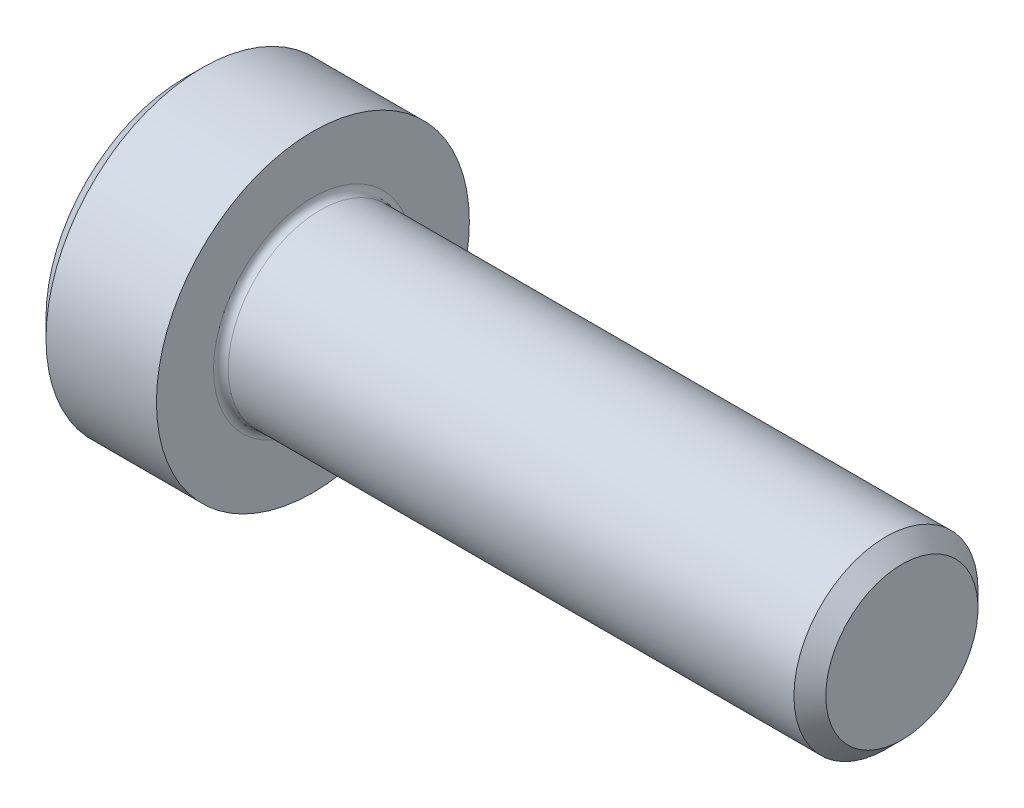
ISO-10303-21;
HEADER;
FILE_DESCRIPTION(('STEP AP214'),'2;1');
FILE_NAME('part.step','',(''),(''),'','','');
FILE_SCHEMA(('AUTOMOTIVE_DESIGN { 1 0 10303 214 1 1 1 1 }'));
ENDSEC;
DATA;
#1=APPLICATION_CONTEXT('core data for automotive mechanical design processes');
#2=APPLICATION_PROTOCOL_DEFINITION('international standard','automotive_design',2000,#1);
#3=PRODUCT_CONTEXT('',#1,'mechanical');
#4=PRODUCT('Part','Part','',(#3));
#5=PRODUCT_RELATED_PRODUCT_CATEGORY('part','',(#4));
#6=PRODUCT_DEFINITION_FORMATION('','',#4);
#7=PRODUCT_DEFINITION_CONTEXT('part definition',#1,'design');
#8=PRODUCT_DEFINITION('design','',#6,#7);
#9=PRODUCT_DEFINITION_SHAPE('','',#8);
#10=(LENGTH_UNIT() NAMED_UNIT(*) SI_UNIT(.MILLI.,.METRE.));
#11=(NAMED_UNIT(*) PLANE_ANGLE_UNIT() SI_UNIT($,.RADIAN.));
#12=(NAMED_UNIT(*) SI_UNIT($,.STERADIAN.) SOLID_ANGLE_UNIT());
#13=UNCERTAINTY_MEASURE_WITH_UNIT(LENGTH_MEASURE(1.E-05),#10,'distance_accuracy_value','');
#14=(GEOMETRIC_REPRESENTATION_CONTEXT(3) GLOBAL_UNCERTAINTY_ASSIGNED_CONTEXT((#13)) GLOBAL_UNIT_ASSIGNED_CONTEXT((#10,
#11,#12)) REPRESENTATION_CONTEXT('',''));
#15=CARTESIAN_POINT('',(0.,0.,0.));
#16=DIRECTION('',(0.,0.,1.));
#17=DIRECTION('',(1.,0.,0.));
#18=AXIS2_PLACEMENT_3D('',#15,#16,#17);
#19=CARTESIAN_POINT('',(-1.,0.,0.));
#20=DIRECTION('',(1.,0.,0.));
#21=DIRECTION('',(0.,0.,-1.));
#22=AXIS2_PLACEMENT_3D('',#19,#20,#21);
#23=PLANE('',#22);
#24=DIRECTION('',(0.,-0.5,-0.866025403784439));
#25=VECTOR('',#24,1.);
#26=CARTESIAN_POINT('',(-1.,-1.15470053837925,2.));
#27=LINE('',#26,#25);
#28=CARTESIAN_POINT('',(-1.,-1.15470053837925,2.));
#29=VERTEX_POINT('',#28);
#30=CARTESIAN_POINT('',(-1.0000000000166,-1.73205080757301,1.0000000000024));
#31=VERTEX_POINT('',#30);
#32=EDGE_CURVE('E118',#29,#31,#27,.T.);
#33=ORIENTED_EDGE('',*,*,#32,.F.);
#34=DIRECTION('',(0.,1.,0.));
#35=VECTOR('',#34,1.);
#36=CARTESIAN_POINT('',(-1.,0.,2.));
#37=LINE('',#36,#35);
#38=CARTESIAN_POINT('',(-1.0000000000166,0.,2.00000000000477));
#39=VERTEX_POINT('',#38);
#40=EDGE_CURVE('E101',#39,#29,#37,.F.);
#41=ORIENTED_EDGE('',*,*,#40,.F.);
#42=CARTESIAN_POINT('',(-1.0000000000332,0.,0.));
#43=DIRECTION('',(-1.,0.,0.));
#44=DIRECTION('',(0.,0.,1.));
#45=AXIS2_PLACEMENT_3D('',#42,#43,#44);
#46=CIRCLE('',#45,2.00000000000955);
#47=EDGE_CURVE('E109',#39,#31,#46,.F.);
#48=ORIENTED_EDGE('',*,*,#47,.T.);
#49=EDGE_LOOP('',(#33,#41,#48));
#50=FACE_BOUND('',#49,.T.);
#51=ADVANCED_FACE('F17',(#50),#23,.F.);
#52=CARTESIAN_POINT('',(-1.,0.,0.));
#53=DIRECTION('',(1.,0.,0.));
#54=DIRECTION('',(0.,0.,-1.));
#55=AXIS2_PLACEMENT_3D('',#52,#53,#54);
#56=PLANE('',#55);
#57=DIRECTION('',(0.,0.499999999999999,-0.866025403784439));
#58=VECTOR('',#57,1.);
#59=CARTESIAN_POINT('',(-1.,-2.3094010767585,0.));
#60=LINE('',#59,#58);
#61=CARTESIAN_POINT('',(-1.,-2.3094010767585,0.));
#62=VERTEX_POINT('',#61);
#63=CARTESIAN_POINT('',(-1.0000000000166,-1.73205080757301,-1.0000000000024));
#64=VERTEX_POINT('',#63);
#65=EDGE_CURVE('E325',#62,#64,#60,.T.);
#66=ORIENTED_EDGE('',*,*,#65,.F.);
#67=DIRECTION('',(0.,-0.499999999999999,-0.866025403784439));
#68=VECTOR('',#67,1.);
#69=CARTESIAN_POINT('',(-1.,-1.73205080756887,1.00000000000001));
#70=LINE('',#69,#68);
#71=EDGE_CURVE('E330',#31,#62,#70,.T.);
#72=ORIENTED_EDGE('',*,*,#71,.F.);
#73=CARTESIAN_POINT('',(-1.0000000000332,0.,0.));
#74=DIRECTION('',(-1.,0.,0.));
#75=DIRECTION('',(0.,0.,1.));
#76=AXIS2_PLACEMENT_3D('',#73,#74,#75);
#77=CIRCLE('',#76,2.00000000000955);
#78=EDGE_CURVE('E135',#31,#64,#77,.F.);
#79=ORIENTED_EDGE('',*,*,#78,.T.);
#80=EDGE_LOOP('',(#66,#72,#79));
#81=FACE_BOUND('',#80,.T.);
#82=ADVANCED_FACE('F227',(#81),#56,.F.);
#83=CARTESIAN_POINT('',(-1.,0.,0.));
#84=DIRECTION('',(1.,0.,0.));
#85=DIRECTION('',(0.,0.,-1.));
#86=AXIS2_PLACEMENT_3D('',#83,#84,#85);
#87=PLANE('',#86);
#88=DIRECTION('',(0.,1.,0.));
#89=VECTOR('',#88,1.);
#90=CARTESIAN_POINT('',(-1.,0.,-2.));
#91=LINE('',#90,#89);
#92=CARTESIAN_POINT('',(-1.,-1.15470053837925,-2.));
#93=VERTEX_POINT('',#92);
#94=CARTESIAN_POINT('',(-1.0000000000166,0.,-2.00000000000477));
#95=VERTEX_POINT('',#94);
#96=EDGE_CURVE('E315',#93,#95,#91,.T.);
#97=ORIENTED_EDGE('',*,*,#96,.F.);
#98=DIRECTION('',(0.,0.5,-0.866025403784439));
#99=VECTOR('',#98,1.);
#100=CARTESIAN_POINT('',(-1.,-1.73205080756887,-1.00000000000001));
#101=LINE('',#100,#99);
#102=EDGE_CURVE('E320',#64,#93,#101,.T.);
#103=ORIENTED_EDGE('',*,*,#102,.F.);
#104=CARTESIAN_POINT('',(-1.0000000000332,0.,0.));
#105=DIRECTION('',(-1.,0.,0.));
#106=DIRECTION('',(0.,0.,1.));
#107=AXIS2_PLACEMENT_3D('',#104,#105,#106);
#108=CIRCLE('',#107,2.00000000000955);
#109=EDGE_CURVE('E141',#64,#95,#108,.F.);
#110=ORIENTED_EDGE('',*,*,#109,.T.);
#111=EDGE_LOOP('',(#97,#103,#110));
#112=FACE_BOUND('',#111,.T.);
#113=ADVANCED_FACE('F224',(#112),#87,.F.);
#114=CARTESIAN_POINT('',(-1.,0.,0.));
#115=DIRECTION('',(1.,0.,0.));
#116=DIRECTION('',(0.,0.,-1.));
#117=AXIS2_PLACEMENT_3D('',#114,#115,#116);
#118=PLANE('',#117);
#119=DIRECTION('',(0.,-0.500000000000002,0.866025403784438));
#120=VECTOR('',#119,1.);
#121=CARTESIAN_POINT('',(-1.,2.3094010767585,0.));
#122=LINE('',#121,#120);
#123=CARTESIAN_POINT('',(-1.,2.3094010767585,0.));
#124=VERTEX_POINT('',#123);
#125=CARTESIAN_POINT('',(-1.0000000000166,1.73205080757302,1.00000000000237));
#126=VERTEX_POINT('',#125);
#127=EDGE_CURVE('E305',#124,#126,#122,.T.);
#128=ORIENTED_EDGE('',*,*,#127,.F.);
#129=DIRECTION('',(0.,0.499999999999999,0.866025403784439));
#130=VECTOR('',#129,1.);
#131=CARTESIAN_POINT('',(-1.,1.73205080756887,-1.00000000000001));
#132=LINE('',#131,#130);
#133=CARTESIAN_POINT('',(-1.0000000000166,1.73205080757301,-1.0000000000024));
#134=VERTEX_POINT('',#133);
#135=EDGE_CURVE('E310',#134,#124,#132,.T.);
#136=ORIENTED_EDGE('',*,*,#135,.F.);
#137=CARTESIAN_POINT('',(-1.0000000000332,0.,0.));
#138=DIRECTION('',(-1.,0.,0.));
#139=DIRECTION('',(0.,0.,1.));
#140=AXIS2_PLACEMENT_3D('',#137,#138,#139);
#141=CIRCLE('',#140,2.00000000000955);
#142=EDGE_CURVE('E128',#134,#126,#141,.F.);
#143=ORIENTED_EDGE('',*,*,#142,.T.);
#144=EDGE_LOOP('',(#128,#136,#143));
#145=FACE_BOUND('',#144,.T.);
#146=ADVANCED_FACE('F221',(#145),#118,.F.);
#147=CARTESIAN_POINT('',(-1.,0.,0.));
#148=DIRECTION('',(1.,0.,0.));
#149=DIRECTION('',(0.,0.,-1.));
#150=AXIS2_PLACEMENT_3D('',#147,#148,#149);
#151=PLANE('',#150);
#152=DIRECTION('',(0.,1.,0.));
#153=VECTOR('',#152,1.);
#154=CARTESIAN_POINT('',(-1.,0.,2.));
#155=LINE('',#154,#153);
#156=CARTESIAN_POINT('',(-1.,1.15470053837925,2.));
#157=VERTEX_POINT('',#156);
#158=EDGE_CURVE('E97',#157,#39,#155,.F.);
#159=ORIENTED_EDGE('',*,*,#158,.F.);
#160=DIRECTION('',(0.,-0.499999999999997,0.86602540378444));
#161=VECTOR('',#160,1.);
#162=CARTESIAN_POINT('',(-1.,1.73205080756888,0.999999999999984));
#163=LINE('',#162,#161);
#164=EDGE_CURVE('E110',#126,#157,#163,.T.);
#165=ORIENTED_EDGE('',*,*,#164,.F.);
#166=CARTESIAN_POINT('',(-1.0000000000332,0.,0.));
#167=DIRECTION('',(-1.,0.,0.));
#168=DIRECTION('',(0.,0.,1.));
#169=AXIS2_PLACEMENT_3D('',#166,#167,#168);
#170=CIRCLE('',#169,2.00000000000955);
#171=EDGE_CURVE('E122',#126,#39,#170,.F.);
#172=ORIENTED_EDGE('',*,*,#171,.T.);
#173=EDGE_LOOP('',(#159,#165,#172));
#174=FACE_BOUND('',#173,.T.);
#175=ADVANCED_FACE('F123',(#174),#151,.F.);
#176=CARTESIAN_POINT('',(-1.0000000000332,0.,0.));
#177=DIRECTION('',(-1.,0.,0.));
#178=DIRECTION('',(0.,0.,1.));
#179=AXIS2_PLACEMENT_3D('',#176,#177,#178);
#180=CONICAL_SURFACE('',#179,2.00000000000955,1.04719755118114);
#181=CARTESIAN_POINT('',(0.154700538359975,0.,0.));
#182=VERTEX_POINT('',#181);
#183=VERTEX_LOOP('',#182);
#184=FACE_BOUND('',#183,.T.);
#185=CARTESIAN_POINT('',(-1.0000000000332,0.,0.));
#186=DIRECTION('',(-1.,0.,0.));
#187=DIRECTION('',(0.,0.,1.));
#188=AXIS2_PLACEMENT_3D('',#185,#186,#187);
#189=CIRCLE('',#188,2.00000000000955);
#190=EDGE_CURVE('E127',#134,#95,#189,.T.);
#191=ORIENTED_EDGE('',*,*,#190,.T.);
#192=ORIENTED_EDGE('',*,*,#109,.F.);
#193=ORIENTED_EDGE('',*,*,#78,.F.);
#194=ORIENTED_EDGE('',*,*,#47,.F.);
#195=ORIENTED_EDGE('',*,*,#171,.F.);
#196=ORIENTED_EDGE('',*,*,#142,.F.);
#197=EDGE_LOOP('',(#191,#192,#193,#194,#195,#196));
#198=FACE_BOUND('',#197,.T.);
#199=ADVANCED_FACE('F132',(#184,#198),#180,.F.);
#200=CARTESIAN_POINT('',(-1.,0.,0.));
#201=DIRECTION('',(1.,0.,0.));
#202=DIRECTION('',(0.,0.,-1.));
#203=AXIS2_PLACEMENT_3D('',#200,#201,#202);
#204=PLANE('',#203);
#205=DIRECTION('',(0.,-0.5,-0.866025403784439));
#206=VECTOR('',#205,1.);
#207=CARTESIAN_POINT('',(-1.,1.15470053837925,-2.));
#208=LINE('',#207,#206);
#209=CARTESIAN_POINT('',(-1.,1.15470053837925,-2.));
#210=VERTEX_POINT('',#209);
#211=EDGE_CURVE('E287',#210,#134,#208,.F.);
#212=ORIENTED_EDGE('',*,*,#211,.F.);
#213=DIRECTION('',(0.,1.,0.));
#214=VECTOR('',#213,1.);
#215=CARTESIAN_POINT('',(-1.,-1.15470053837925,-2.));
#216=LINE('',#215,#214);
#217=EDGE_CURVE('E282',#95,#210,#216,.T.);
#218=ORIENTED_EDGE('',*,*,#217,.F.);
#219=ORIENTED_EDGE('',*,*,#190,.F.);
#220=EDGE_LOOP('',(#212,#218,#219));
#221=FACE_BOUND('',#220,.T.);
#222=ADVANCED_FACE('F211',(#221),#204,.F.);
#223=CARTESIAN_POINT('',(-1.,1.15470053837925,-2.));
#224=DIRECTION('',(0.,-0.866025403784439,0.5));
#225=DIRECTION('',(0.,-0.5,-0.866025403784439));
#226=AXIS2_PLACEMENT_3D('',#223,#224,#225);
#227=PLANE('',#226);
#228=ORIENTED_EDGE('',*,*,#135,.T.);
#229=DIRECTION('',(1.,0.,0.));
#230=VECTOR('',#229,1.);
#231=CARTESIAN_POINT('',(-1.,2.3094010767585,0.));
#232=LINE('',#231,#230);
#233=CARTESIAN_POINT('',(-3.5,2.3094010767585,0.));
#234=VERTEX_POINT('',#233);
#235=EDGE_CURVE('E344',#234,#124,#232,.T.);
#236=ORIENTED_EDGE('',*,*,#235,.F.);
#237=DIRECTION('',(0.,-0.5,-0.866025403784439));
#238=VECTOR('',#237,1.);
#239=CARTESIAN_POINT('',(-3.5,2.3094010767585,0.));
#240=LINE('',#239,#238);
#241=CARTESIAN_POINT('',(-3.5,1.15470053837925,-2.));
#242=VERTEX_POINT('',#241);
#243=EDGE_CURVE('E279',#234,#242,#240,.T.);
#244=ORIENTED_EDGE('',*,*,#243,.T.);
#245=DIRECTION('',(1.,0.,0.));
#246=VECTOR('',#245,1.);
#247=CARTESIAN_POINT('',(-1.,1.15470053837925,-2.));
#248=LINE('',#247,#246);
#249=EDGE_CURVE('E286',#210,#242,#248,.F.);
#250=ORIENTED_EDGE('',*,*,#249,.F.);
#251=ORIENTED_EDGE('',*,*,#211,.T.);
#252=EDGE_LOOP('',(#228,#236,#244,#250,#251));
#253=FACE_BOUND('',#252,.T.);
#254=ADVANCED_FACE('F207',(#253),#227,.T.);
#255=CARTESIAN_POINT('',(-1.,-1.15470053837925,-2.));
#256=DIRECTION('',(0.,0.,1.));
#257=DIRECTION('',(1.,0.,0.));
#258=AXIS2_PLACEMENT_3D('',#255,#256,#257);
#259=PLANE('',#258);
#260=ORIENTED_EDGE('',*,*,#217,.T.);
#261=ORIENTED_EDGE('',*,*,#249,.T.);
#262=DIRECTION('',(0.,1.,0.));
#263=VECTOR('',#262,1.);
#264=CARTESIAN_POINT('',(-3.5,0.,-2.));
#265=LINE('',#264,#263);
#266=CARTESIAN_POINT('',(-3.5,-1.15470053837925,-2.));
#267=VERTEX_POINT('',#266);
#268=EDGE_CURVE('E276',#242,#267,#265,.F.);
#269=ORIENTED_EDGE('',*,*,#268,.T.);
#270=DIRECTION('',(1.,0.,0.));
#271=VECTOR('',#270,1.);
#272=CARTESIAN_POINT('',(-1.,-1.15470053837925,-2.));
#273=LINE('',#272,#271);
#274=EDGE_CURVE('E293',#93,#267,#273,.F.);
#275=ORIENTED_EDGE('',*,*,#274,.F.);
#276=ORIENTED_EDGE('',*,*,#96,.T.);
#277=EDGE_LOOP('',(#260,#261,#269,#275,#276));
#278=FACE_BOUND('',#277,.T.);
#279=ADVANCED_FACE('F203',(#278),#259,.T.);
#280=CARTESIAN_POINT('',(-1.,-2.3094010767585,0.));
#281=DIRECTION('',(0.,0.866025403784439,0.5));
#282=DIRECTION('',(0.,-0.5,0.866025403784439));
#283=AXIS2_PLACEMENT_3D('',#280,#281,#282);
#284=PLANE('',#283);
#285=ORIENTED_EDGE('',*,*,#102,.T.);
#286=ORIENTED_EDGE('',*,*,#274,.T.);
#287=DIRECTION('',(0.,-0.499999999999999,0.866025403784439));
#288=VECTOR('',#287,1.);
#289=CARTESIAN_POINT('',(-3.5,-1.15470053837925,-2.));
#290=LINE('',#289,#288);
#291=CARTESIAN_POINT('',(-3.5,-2.3094010767585,0.));
#292=VERTEX_POINT('',#291);
#293=EDGE_CURVE('E273',#267,#292,#290,.T.);
#294=ORIENTED_EDGE('',*,*,#293,.T.);
#295=DIRECTION('',(1.,0.,0.));
#296=VECTOR('',#295,1.);
#297=CARTESIAN_POINT('',(-1.,-2.3094010767585,0.));
#298=LINE('',#297,#296);
#299=EDGE_CURVE('E356',#62,#292,#298,.F.);
#300=ORIENTED_EDGE('',*,*,#299,.F.);
#301=ORIENTED_EDGE('',*,*,#65,.T.);
#302=EDGE_LOOP('',(#285,#286,#294,#300,#301));
#303=FACE_BOUND('',#302,.T.);
#304=ADVANCED_FACE('F199',(#303),#284,.T.);
#305=CARTESIAN_POINT('',(-1.,-1.15470053837925,2.));
#306=DIRECTION('',(0.,0.866025403784439,-0.5));
#307=DIRECTION('',(0.,0.5,0.866025403784439));
#308=AXIS2_PLACEMENT_3D('',#305,#306,#307);
#309=PLANE('',#308);
#310=ORIENTED_EDGE('',*,*,#71,.T.);
#311=ORIENTED_EDGE('',*,*,#299,.T.);
#312=DIRECTION('',(0.,0.5,0.866025403784439));
#313=VECTOR('',#312,1.);
#314=CARTESIAN_POINT('',(-3.5,-2.3094010767585,0.));
#315=LINE('',#314,#313);
#316=CARTESIAN_POINT('',(-3.5,-1.15470053837925,2.));
#317=VERTEX_POINT('',#316);
#318=EDGE_CURVE('E270',#292,#317,#315,.T.);
#319=ORIENTED_EDGE('',*,*,#318,.T.);
#320=DIRECTION('',(-1.,0.,0.));
#321=VECTOR('',#320,1.);
#322=CARTESIAN_POINT('',(-1.,-1.15470053837925,2.));
#323=LINE('',#322,#321);
#324=EDGE_CURVE('E350',#29,#317,#323,.T.);
#325=ORIENTED_EDGE('',*,*,#324,.F.);
#326=ORIENTED_EDGE('',*,*,#32,.T.);
#327=EDGE_LOOP('',(#310,#311,#319,#325,#326));
#328=FACE_BOUND('',#327,.T.);
#329=ADVANCED_FACE('F196',(#328),#309,.T.);
#330=CARTESIAN_POINT('',(-1.,1.15470053837925,2.));
#331=DIRECTION('',(0.,0.,-1.));
#332=DIRECTION('',(-1.,0.,0.));
#333=AXIS2_PLACEMENT_3D('',#330,#331,#332);
#334=PLANE('',#333);
#335=ORIENTED_EDGE('',*,*,#40,.T.);
#336=ORIENTED_EDGE('',*,*,#324,.T.);
#337=DIRECTION('',(0.,1.,0.));
#338=VECTOR('',#337,1.);
#339=CARTESIAN_POINT('',(-3.5,0.,2.));
#340=LINE('',#339,#338);
#341=CARTESIAN_POINT('',(-3.5,1.15470053837925,2.));
#342=VERTEX_POINT('',#341);
#343=EDGE_CURVE('E267',#317,#342,#340,.T.);
#344=ORIENTED_EDGE('',*,*,#343,.T.);
#345=DIRECTION('',(1.,0.,0.));
#346=VECTOR('',#345,1.);
#347=CARTESIAN_POINT('',(-1.,1.15470053837925,2.));
#348=LINE('',#347,#346);
#349=EDGE_CURVE('E104',#157,#342,#348,.F.);
#350=ORIENTED_EDGE('',*,*,#349,.F.);
#351=ORIENTED_EDGE('',*,*,#158,.T.);
#352=EDGE_LOOP('',(#335,#336,#344,#350,#351));
#353=FACE_BOUND('',#352,.T.);
#354=ADVANCED_FACE('F99',(#353),#334,.T.);
#355=CARTESIAN_POINT('',(-1.,2.3094010767585,0.));
#356=DIRECTION('',(0.,-0.866025403784439,-0.5));
#357=DIRECTION('',(0.,0.5,-0.866025403784439));
#358=AXIS2_PLACEMENT_3D('',#355,#356,#357);
#359=PLANE('',#358);
#360=ORIENTED_EDGE('',*,*,#164,.T.);
#361=ORIENTED_EDGE('',*,*,#349,.T.);
#362=DIRECTION('',(0.,0.499999999999999,-0.866025403784439));
#363=VECTOR('',#362,1.);
#364=CARTESIAN_POINT('',(-3.5,1.15470053837925,2.));
#365=LINE('',#364,#363);
#366=EDGE_CURVE('E263',#342,#234,#365,.T.);
#367=ORIENTED_EDGE('',*,*,#366,.T.);
#368=ORIENTED_EDGE('',*,*,#235,.T.);
#369=ORIENTED_EDGE('',*,*,#127,.T.);
#370=EDGE_LOOP('',(#360,#361,#367,#368,#369));
#371=FACE_BOUND('',#370,.T.);
#372=ADVANCED_FACE('F189',(#371),#359,.T.);
#373=CARTESIAN_POINT('',(-3.5,0.,0.));
#374=DIRECTION('',(1.,0.,0.));
#375=DIRECTION('',(0.,0.,-1.));
#376=AXIS2_PLACEMENT_3D('',#373,#374,#375);
#377=PLANE('',#376);
#378=ORIENTED_EDGE('',*,*,#343,.F.);
#379=ORIENTED_EDGE('',*,*,#318,.F.);
#380=ORIENTED_EDGE('',*,*,#293,.F.);
#381=ORIENTED_EDGE('',*,*,#268,.F.);
#382=ORIENTED_EDGE('',*,*,#243,.F.);
#383=ORIENTED_EDGE('',*,*,#366,.F.);
#384=EDGE_LOOP('',(#378,#379,#380,#381,#382,#383));
#385=FACE_BOUND('',#384,.T.);
#386=CARTESIAN_POINT('',(-3.50000000003092,0.,0.));
#387=DIRECTION('',(1.,0.,0.));
#388=DIRECTION('',(0.,0.,-1.));
#389=AXIS2_PLACEMENT_3D('',#386,#387,#388);
#390=CIRCLE('',#389,3.74999999996817);
#391=CARTESIAN_POINT('',(-3.50000000003092,0.,-3.74999999996817));
#392=VERTEX_POINT('',#391);
#393=EDGE_CURVE('E262',#392,#392,#390,.T.);
#394=ORIENTED_EDGE('',*,*,#393,.F.);
#395=EDGE_LOOP('',(#394));
#396=FACE_BOUND('',#395,.T.);
#397=ADVANCED_FACE('F185',(#385,#396),#377,.F.);
#398=CARTESIAN_POINT('',(-2.99999999992906,0.,0.));
#399=DIRECTION('',(1.,0.,0.));
#400=DIRECTION('',(0.,0.,-1.));
#401=AXIS2_PLACEMENT_3D('',#398,#399,#400);
#402=CONICAL_SURFACE('',#401,4.25000000007003,0.785398163397448);
#403=ORIENTED_EDGE('',*,*,#393,.T.);
#404=EDGE_LOOP('',(#403));
#405=FACE_BOUND('',#404,.T.);
#406=CARTESIAN_POINT('',(-3.,0.,0.));
#407=DIRECTION('',(-1.,0.,0.));
#408=DIRECTION('',(0.,0.,1.));
#409=AXIS2_PLACEMENT_3D('',#406,#407,#408);
#410=CIRCLE('',#409,4.25);
#411=CARTESIAN_POINT('',(-3.,0.,4.25));
#412=VERTEX_POINT('',#411);
#413=EDGE_CURVE('E258',#412,#412,#410,.F.);
#414=ORIENTED_EDGE('',*,*,#413,.F.);
#415=EDGE_LOOP('',(#414));
#416=FACE_BOUND('',#415,.T.);
#417=ADVANCED_FACE('F181',(#405,#416),#402,.T.);
#418=CARTESIAN_POINT('',(16.,0.,0.));
#419=DIRECTION('',(-1.,0.,0.));
#420=DIRECTION('',(0.,0.,1.));
#421=AXIS2_PLACEMENT_3D('',#418,#419,#420);
#422=CYLINDRICAL_SURFACE('',#421,4.25);
#423=ORIENTED_EDGE('',*,*,#413,.T.);
#424=EDGE_LOOP('',(#423));
#425=FACE_BOUND('',#424,.T.);
#426=CARTESIAN_POINT('',(0.,0.,0.));
#427=DIRECTION('',(-1.,0.,0.));
#428=DIRECTION('',(0.,0.,1.));
#429=AXIS2_PLACEMENT_3D('',#426,#427,#428);
#430=CIRCLE('',#429,4.25);
#431=CARTESIAN_POINT('',(0.,0.,4.25));
#432=VERTEX_POINT('',#431);
#433=EDGE_CURVE('E150',#432,#432,#430,.T.);
#434=ORIENTED_EDGE('',*,*,#433,.T.);
#435=EDGE_LOOP('',(#434));
#436=FACE_BOUND('',#435,.T.);
#437=ADVANCED_FACE('F177',(#425,#436),#422,.T.);
#438=CARTESIAN_POINT('',(16.,2.067,0.));
#439=DIRECTION('',(-1.,0.,0.));
#440=DIRECTION('',(0.,0.,1.));
#441=AXIS2_PLACEMENT_3D('',#438,#439,#440);
#442=PLANE('',#441);
#443=CARTESIAN_POINT('',(16.0000000000196,0.,0.));
#444=DIRECTION('',(-1.,0.,0.));
#445=DIRECTION('',(0.,0.,1.));
#446=AXIS2_PLACEMENT_3D('',#443,#444,#445);
#447=CIRCLE('',#446,2.06699999995408);
#448=CARTESIAN_POINT('',(16.0000000000196,0.,2.06699999995408));
#449=VERTEX_POINT('',#448);
#450=EDGE_CURVE('E149',#449,#449,#447,.T.);
#451=ORIENTED_EDGE('',*,*,#450,.F.);
#452=EDGE_LOOP('',(#451));
#453=FACE_BOUND('',#452,.T.);
#454=ADVANCED_FACE('F173',(#453),#442,.F.);
#455=CARTESIAN_POINT('',(0.,4.25,0.));
#456=DIRECTION('',(-1.,0.,0.));
#457=DIRECTION('',(0.,0.,1.));
#458=AXIS2_PLACEMENT_3D('',#455,#456,#457);
#459=PLANE('',#458);
#460=CARTESIAN_POINT('',(0.,0.,0.));
#461=DIRECTION('',(1.,0.,0.));
#462=DIRECTION('',(0.,0.,-1.));
#463=AXIS2_PLACEMENT_3D('',#460,#461,#462);
#464=CIRCLE('',#463,2.7);
#465=CARTESIAN_POINT('',(0.,0.,2.7));
#466=VERTEX_POINT('',#465);
#467=CARTESIAN_POINT('',(0.,0.,-2.7));
#468=VERTEX_POINT('',#467);
#469=EDGE_CURVE('E37',#466,#468,#464,.F.);
#470=ORIENTED_EDGE('',*,*,#469,.T.);
#471=CARTESIAN_POINT('',(0.,0.,0.));
#472=DIRECTION('',(1.,0.,0.));
#473=DIRECTION('',(0.,0.,1.));
#474=AXIS2_PLACEMENT_3D('',#471,#472,#473);
#475=CIRCLE('',#474,2.7);
#476=EDGE_CURVE('E146',#468,#466,#475,.F.);
#477=ORIENTED_EDGE('',*,*,#476,.T.);
#478=EDGE_LOOP('',(#470,#477));
#479=FACE_BOUND('',#478,.T.);
#480=ORIENTED_EDGE('',*,*,#433,.F.);
#481=EDGE_LOOP('',(#480));
#482=FACE_BOUND('',#481,.T.);
#483=ADVANCED_FACE('F152',(#479,#482),#459,.F.);
#484=CARTESIAN_POINT('',(15.5669999999191,0.,0.));
#485=DIRECTION('',(-1.,0.,0.));
#486=DIRECTION('',(0.,0.,1.));
#487=AXIS2_PLACEMENT_3D('',#484,#485,#486);
#488=CONICAL_SURFACE('',#487,2.50000000005457,0.785398163397448);
#489=ORIENTED_EDGE('',*,*,#450,.T.);
#490=EDGE_LOOP('',(#489));
#491=FACE_BOUND('',#490,.T.);
#492=CARTESIAN_POINT('',(15.567,0.,0.));
#493=DIRECTION('',(-1.,0.,0.));
#494=DIRECTION('',(0.,0.,1.));
#495=AXIS2_PLACEMENT_3D('',#492,#493,#494);
#496=CIRCLE('',#495,2.5);
#497=CARTESIAN_POINT('',(15.567,0.,2.5));
#498=VERTEX_POINT('',#497);
#499=EDGE_CURVE('E29',#498,#498,#496,.T.);
#500=ORIENTED_EDGE('',*,*,#499,.F.);
#501=EDGE_LOOP('',(#500));
#502=FACE_BOUND('',#501,.T.);
#503=ADVANCED_FACE('F172',(#491,#502),#488,.T.);
#504=CARTESIAN_POINT('',(0.2,0.,0.));
#505=DIRECTION('',(1.,0.,0.));
#506=DIRECTION('',(0.,0.,-1.));
#507=AXIS2_PLACEMENT_3D('',#504,#505,#506);
#508=TOROIDAL_SURFACE('',#507,2.7,0.2);
#509=CARTESIAN_POINT('',(0.199999999999999,0.,0.));
#510=DIRECTION('',(-1.,0.,0.));
#511=DIRECTION('',(0.,0.,1.));
#512=AXIS2_PLACEMENT_3D('',#509,#510,#511);
#513=CIRCLE('',#512,2.5);
#514=CARTESIAN_POINT('',(0.199999999999999,0.,2.5));
#515=VERTEX_POINT('',#514);
#516=EDGE_CURVE('E11',#515,#515,#513,.F.);
#517=ORIENTED_EDGE('',*,*,#516,.F.);
#518=EDGE_LOOP('',(#517));
#519=FACE_BOUND('',#518,.T.);
#520=ORIENTED_EDGE('',*,*,#476,.F.);
#521=ORIENTED_EDGE('',*,*,#469,.F.);
#522=EDGE_LOOP('',(#520,#521));
#523=FACE_BOUND('',#522,.T.);
#524=ADVANCED_FACE('F145',(#519,#523),#508,.F.);
#525=CARTESIAN_POINT('',(16.,0.,0.));
#526=DIRECTION('',(-1.,0.,0.));
#527=DIRECTION('',(0.,0.,1.));
#528=AXIS2_PLACEMENT_3D('',#525,#526,#527);
#529=CYLINDRICAL_SURFACE('',#528,2.5);
#530=ORIENTED_EDGE('',*,*,#516,.T.);
#531=EDGE_LOOP('',(#530));
#532=FACE_BOUND('',#531,.T.);
#533=ORIENTED_EDGE('',*,*,#499,.T.);
#534=EDGE_LOOP('',(#533));
#535=FACE_BOUND('',#534,.T.);
#536=ADVANCED_FACE('F235',(#532,#535),#529,.T.);
#537=CLOSED_SHELL('',(#51,#82,#113,#146,#175,#199,#222,#254,#279,#304,#329,#354,#372,#397,#417,
#437,#454,#483,#503,#524,#536));
#538=MANIFOLD_SOLID_BREP('B1',#537);
#539=ADVANCED_BREP_SHAPE_REPRESENTATION('',(#18,#538),#14);
#540=SHAPE_DEFINITION_REPRESENTATION(#9,#539);
ENDSEC;
END-ISO-10303-21;
